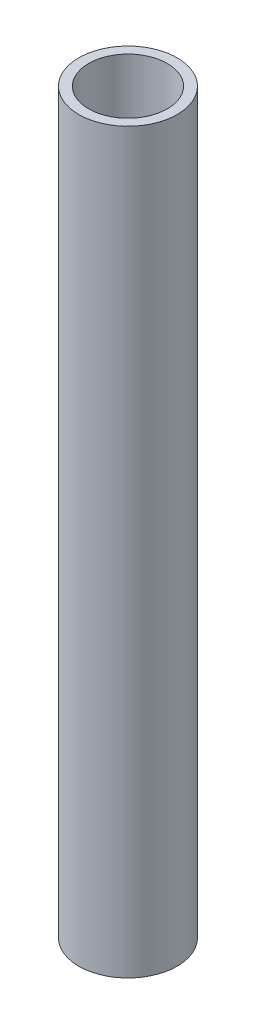
ISO-10303-21;
HEADER;
FILE_DESCRIPTION(('STEP AP214'),'2;1');
FILE_NAME('part.step','',(''),(''),'','','');
FILE_SCHEMA(('AUTOMOTIVE_DESIGN { 1 0 10303 214 1 1 1 1 }'));
ENDSEC;
DATA;
#1=APPLICATION_CONTEXT('core data for automotive mechanical design processes');
#2=APPLICATION_PROTOCOL_DEFINITION('international standard','automotive_design',2000,#1);
#3=PRODUCT_CONTEXT('',#1,'mechanical');
#4=PRODUCT('Part','Part','',(#3));
#5=PRODUCT_RELATED_PRODUCT_CATEGORY('part','',(#4));
#6=PRODUCT_DEFINITION_FORMATION('','',#4);
#7=PRODUCT_DEFINITION_CONTEXT('part definition',#1,'design');
#8=PRODUCT_DEFINITION('design','',#6,#7);
#9=PRODUCT_DEFINITION_SHAPE('','',#8);
#10=(LENGTH_UNIT() NAMED_UNIT(*) SI_UNIT(.MILLI.,.METRE.));
#11=(NAMED_UNIT(*) PLANE_ANGLE_UNIT() SI_UNIT($,.RADIAN.));
#12=(NAMED_UNIT(*) SI_UNIT($,.STERADIAN.) SOLID_ANGLE_UNIT());
#13=UNCERTAINTY_MEASURE_WITH_UNIT(LENGTH_MEASURE(1.E-05),#10,'distance_accuracy_value','');
#14=(GEOMETRIC_REPRESENTATION_CONTEXT(3) GLOBAL_UNCERTAINTY_ASSIGNED_CONTEXT((#13)) GLOBAL_UNIT_ASSIGNED_CONTEXT((#10,
#11,#12)) REPRESENTATION_CONTEXT('',''));
#15=CARTESIAN_POINT('',(0.,0.,0.));
#16=DIRECTION('',(0.,0.,1.));
#17=DIRECTION('',(1.,0.,0.));
#18=AXIS2_PLACEMENT_3D('',#15,#16,#17);
#19=CARTESIAN_POINT('',(0.,150.,0.));
#20=DIRECTION('',(0.,1.,0.));
#21=DIRECTION('',(0.,0.,1.));
#22=AXIS2_PLACEMENT_3D('',#19,#20,#21);
#23=PLANE('',#22);
#24=CARTESIAN_POINT('',(0.,150.,0.));
#25=DIRECTION('',(0.,1.,0.));
#26=DIRECTION('',(0.,0.,1.));
#27=AXIS2_PLACEMENT_3D('',#24,#25,#26);
#28=CIRCLE('',#27,10.);
#29=CARTESIAN_POINT('',(0.,150.,10.));
#30=VERTEX_POINT('',#29);
#31=EDGE_CURVE('E10',#30,#30,#28,.T.);
#32=ORIENTED_EDGE('',*,*,#31,.T.);
#33=EDGE_LOOP('',(#32));
#34=FACE_BOUND('',#33,.T.);
#35=CARTESIAN_POINT('',(0.,150.,0.));
#36=DIRECTION('',(0.,1.,0.));
#37=DIRECTION('',(0.,0.,1.));
#38=AXIS2_PLACEMENT_3D('',#35,#36,#37);
#39=CIRCLE('',#38,8.);
#40=CARTESIAN_POINT('',(0.,150.,8.));
#41=VERTEX_POINT('',#40);
#42=EDGE_CURVE('E48',#41,#41,#39,.T.);
#43=ORIENTED_EDGE('',*,*,#42,.F.);
#44=EDGE_LOOP('',(#43));
#45=FACE_BOUND('',#44,.T.);
#46=ADVANCED_FACE('F37',(#34,#45),#23,.T.);
#47=CARTESIAN_POINT('',(0.,0.,0.));
#48=DIRECTION('',(0.,1.,0.));
#49=DIRECTION('',(0.,0.,1.));
#50=AXIS2_PLACEMENT_3D('',#47,#48,#49);
#51=PLANE('',#50);
#52=CARTESIAN_POINT('',(0.,0.,0.));
#53=DIRECTION('',(0.,1.,0.));
#54=DIRECTION('',(0.,0.,1.));
#55=AXIS2_PLACEMENT_3D('',#52,#53,#54);
#56=CIRCLE('',#55,10.);
#57=CARTESIAN_POINT('',(0.,0.,10.));
#58=VERTEX_POINT('',#57);
#59=EDGE_CURVE('E41',#58,#58,#56,.T.);
#60=ORIENTED_EDGE('',*,*,#59,.F.);
#61=EDGE_LOOP('',(#60));
#62=FACE_BOUND('',#61,.T.);
#63=CARTESIAN_POINT('',(0.,0.,0.));
#64=DIRECTION('',(0.,1.,0.));
#65=DIRECTION('',(0.,0.,1.));
#66=AXIS2_PLACEMENT_3D('',#63,#64,#65);
#67=CIRCLE('',#66,8.);
#68=CARTESIAN_POINT('',(0.,0.,8.));
#69=VERTEX_POINT('',#68);
#70=EDGE_CURVE('E50',#69,#69,#67,.T.);
#71=ORIENTED_EDGE('',*,*,#70,.T.);
#72=EDGE_LOOP('',(#71));
#73=FACE_BOUND('',#72,.T.);
#74=ADVANCED_FACE('F60',(#62,#73),#51,.F.);
#75=CARTESIAN_POINT('',(0.,150.,0.));
#76=DIRECTION('',(0.,-1.,0.));
#77=DIRECTION('',(0.,0.,-1.));
#78=AXIS2_PLACEMENT_3D('',#75,#76,#77);
#79=CYLINDRICAL_SURFACE('',#78,10.);
#80=ORIENTED_EDGE('',*,*,#31,.F.);
#81=EDGE_LOOP('',(#80));
#82=FACE_BOUND('',#81,.T.);
#83=ORIENTED_EDGE('',*,*,#59,.T.);
#84=EDGE_LOOP('',(#83));
#85=FACE_BOUND('',#84,.T.);
#86=ADVANCED_FACE('F39',(#82,#85),#79,.T.);
#87=CARTESIAN_POINT('',(0.,150.,0.));
#88=DIRECTION('',(0.,-1.,0.));
#89=DIRECTION('',(0.,0.,-1.));
#90=AXIS2_PLACEMENT_3D('',#87,#88,#89);
#91=CYLINDRICAL_SURFACE('',#90,8.);
#92=ORIENTED_EDGE('',*,*,#42,.T.);
#93=EDGE_LOOP('',(#92));
#94=FACE_BOUND('',#93,.T.);
#95=ORIENTED_EDGE('',*,*,#70,.F.);
#96=EDGE_LOOP('',(#95));
#97=FACE_BOUND('',#96,.T.);
#98=ADVANCED_FACE('F56',(#94,#97),#91,.F.);
#99=CLOSED_SHELL('',(#46,#74,#86,#98));
#100=MANIFOLD_SOLID_BREP('B2',#99);
#101=ADVANCED_BREP_SHAPE_REPRESENTATION('',(#18,#100),#14);
#102=SHAPE_DEFINITION_REPRESENTATION(#9,#101);
ENDSEC;
END-ISO-10303-21;
